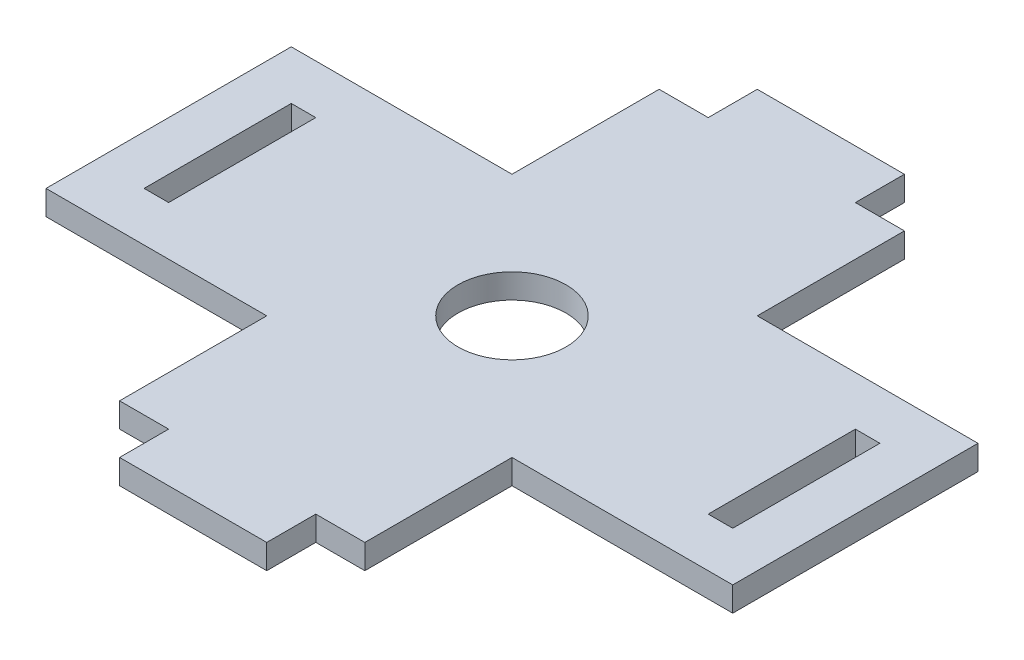
ISO-10303-21;
HEADER;
FILE_DESCRIPTION(('STEP AP214'),'2;1');
FILE_NAME('part.step','',(''),(''),'','','');
FILE_SCHEMA(('AUTOMOTIVE_DESIGN { 1 0 10303 214 1 1 1 1 }'));
ENDSEC;
DATA;
#1=APPLICATION_CONTEXT('core data for automotive mechanical design processes');
#2=APPLICATION_PROTOCOL_DEFINITION('international standard','automotive_design',2000,#1);
#3=PRODUCT_CONTEXT('',#1,'mechanical');
#4=PRODUCT('Part','Part','',(#3));
#5=PRODUCT_RELATED_PRODUCT_CATEGORY('part','',(#4));
#6=PRODUCT_DEFINITION_FORMATION('','',#4);
#7=PRODUCT_DEFINITION_CONTEXT('part definition',#1,'design');
#8=PRODUCT_DEFINITION('design','',#6,#7);
#9=PRODUCT_DEFINITION_SHAPE('','',#8);
#10=(LENGTH_UNIT() NAMED_UNIT(*) SI_UNIT(.MILLI.,.METRE.));
#11=(NAMED_UNIT(*) PLANE_ANGLE_UNIT() SI_UNIT($,.RADIAN.));
#12=(NAMED_UNIT(*) SI_UNIT($,.STERADIAN.) SOLID_ANGLE_UNIT());
#13=UNCERTAINTY_MEASURE_WITH_UNIT(LENGTH_MEASURE(1.E-05),#10,'distance_accuracy_value','');
#14=(GEOMETRIC_REPRESENTATION_CONTEXT(3) GLOBAL_UNCERTAINTY_ASSIGNED_CONTEXT((#13)) GLOBAL_UNIT_ASSIGNED_CONTEXT((#10,
#11,#12)) REPRESENTATION_CONTEXT('',''));
#15=CARTESIAN_POINT('',(0.,0.,0.));
#16=DIRECTION('',(0.,0.,1.));
#17=DIRECTION('',(1.,0.,0.));
#18=AXIS2_PLACEMENT_3D('',#15,#16,#17);
#19=CARTESIAN_POINT('',(-15.,5.,-55.));
#20=DIRECTION('',(0.,0.,1.));
#21=DIRECTION('',(1.,0.,0.));
#22=AXIS2_PLACEMENT_3D('',#19,#20,#21);
#23=PLANE('',#22);
#24=DIRECTION('',(-1.,0.,0.));
#25=VECTOR('',#24,1.);
#26=CARTESIAN_POINT('',(-15.,0.,-55.));
#27=LINE('',#26,#25);
#28=CARTESIAN_POINT('',(-15.,0.,-55.));
#29=VERTEX_POINT('',#28);
#30=CARTESIAN_POINT('',(-25.,0.,-55.));
#31=VERTEX_POINT('',#30);
#32=EDGE_CURVE('E334',#29,#31,#27,.T.);
#33=ORIENTED_EDGE('',*,*,#32,.T.);
#34=DIRECTION('',(0.,-1.,0.));
#35=VECTOR('',#34,1.);
#36=CARTESIAN_POINT('',(-25.,100.,-55.));
#37=LINE('',#36,#35);
#38=CARTESIAN_POINT('',(-25.,5.,-55.));
#39=VERTEX_POINT('',#38);
#40=EDGE_CURVE('E239',#39,#31,#37,.T.);
#41=ORIENTED_EDGE('',*,*,#40,.F.);
#42=DIRECTION('',(-1.,0.,0.));
#43=VECTOR('',#42,1.);
#44=CARTESIAN_POINT('',(-15.,5.,-55.));
#45=LINE('',#44,#43);
#46=CARTESIAN_POINT('',(-15.,5.,-55.));
#47=VERTEX_POINT('',#46);
#48=EDGE_CURVE('E359',#47,#39,#45,.T.);
#49=ORIENTED_EDGE('',*,*,#48,.F.);
#50=DIRECTION('',(0.,-1.,0.));
#51=VECTOR('',#50,1.);
#52=CARTESIAN_POINT('',(-15.,5.,-55.));
#53=LINE('',#52,#51);
#54=EDGE_CURVE('E388',#47,#29,#53,.T.);
#55=ORIENTED_EDGE('',*,*,#54,.T.);
#56=EDGE_LOOP('',(#33,#41,#49,#55));
#57=FACE_BOUND('',#56,.T.);
#58=ADVANCED_FACE('F44',(#57),#23,.F.);
#59=CARTESIAN_POINT('',(-70.,5.,55.));
#60=DIRECTION('',(1.,0.,0.));
#61=DIRECTION('',(0.,0.,-1.));
#62=AXIS2_PLACEMENT_3D('',#59,#60,#61);
#63=PLANE('',#62);
#64=DIRECTION('',(0.,0.,1.));
#65=VECTOR('',#64,1.);
#66=CARTESIAN_POINT('',(-70.,5.,55.));
#67=LINE('',#66,#65);
#68=CARTESIAN_POINT('',(-70.,5.,-25.));
#69=VERTEX_POINT('',#68);
#70=CARTESIAN_POINT('',(-70.,5.,25.));
#71=VERTEX_POINT('',#70);
#72=EDGE_CURVE('E362',#69,#71,#67,.T.);
#73=ORIENTED_EDGE('',*,*,#72,.F.);
#74=DIRECTION('',(0.,-1.,0.));
#75=VECTOR('',#74,1.);
#76=CARTESIAN_POINT('',(-70.,100.,-25.));
#77=LINE('',#76,#75);
#78=CARTESIAN_POINT('',(-70.,0.,-25.));
#79=VERTEX_POINT('',#78);
#80=EDGE_CURVE('E238',#69,#79,#77,.T.);
#81=ORIENTED_EDGE('',*,*,#80,.T.);
#82=DIRECTION('',(0.,0.,1.));
#83=VECTOR('',#82,1.);
#84=CARTESIAN_POINT('',(-70.,0.,55.));
#85=LINE('',#84,#83);
#86=CARTESIAN_POINT('',(-70.,0.,25.));
#87=VERTEX_POINT('',#86);
#88=EDGE_CURVE('E255',#79,#87,#85,.T.);
#89=ORIENTED_EDGE('',*,*,#88,.T.);
#90=DIRECTION('',(0.,-1.,0.));
#91=VECTOR('',#90,1.);
#92=CARTESIAN_POINT('',(-70.,100.,25.));
#93=LINE('',#92,#91);
#94=EDGE_CURVE('E58',#71,#87,#93,.T.);
#95=ORIENTED_EDGE('',*,*,#94,.F.);
#96=EDGE_LOOP('',(#73,#81,#89,#95));
#97=FACE_BOUND('',#96,.T.);
#98=ADVANCED_FACE('F525',(#97),#63,.F.);
#99=CARTESIAN_POINT('',(-15.,5.,55.));
#100=DIRECTION('',(0.,0.,-1.));
#101=DIRECTION('',(-1.,0.,0.));
#102=AXIS2_PLACEMENT_3D('',#99,#100,#101);
#103=PLANE('',#102);
#104=DIRECTION('',(1.,0.,0.));
#105=VECTOR('',#104,1.);
#106=CARTESIAN_POINT('',(-15.,5.,55.));
#107=LINE('',#106,#105);
#108=CARTESIAN_POINT('',(-25.,5.,55.));
#109=VERTEX_POINT('',#108);
#110=CARTESIAN_POINT('',(-15.,5.,55.));
#111=VERTEX_POINT('',#110);
#112=EDGE_CURVE('E366',#109,#111,#107,.T.);
#113=ORIENTED_EDGE('',*,*,#112,.F.);
#114=DIRECTION('',(0.,-1.,0.));
#115=VECTOR('',#114,1.);
#116=CARTESIAN_POINT('',(-25.,100.,55.));
#117=LINE('',#116,#115);
#118=CARTESIAN_POINT('',(-25.,0.,55.));
#119=VERTEX_POINT('',#118);
#120=EDGE_CURVE('E285',#109,#119,#117,.T.);
#121=ORIENTED_EDGE('',*,*,#120,.T.);
#122=DIRECTION('',(1.,0.,0.));
#123=VECTOR('',#122,1.);
#124=CARTESIAN_POINT('',(-15.,0.,55.));
#125=LINE('',#124,#123);
#126=CARTESIAN_POINT('',(-15.,0.,55.));
#127=VERTEX_POINT('',#126);
#128=EDGE_CURVE('E391',#119,#127,#125,.T.);
#129=ORIENTED_EDGE('',*,*,#128,.T.);
#130=DIRECTION('',(0.,-1.,0.));
#131=VECTOR('',#130,1.);
#132=CARTESIAN_POINT('',(-15.,5.,55.));
#133=LINE('',#132,#131);
#134=EDGE_CURVE('E432',#111,#127,#133,.T.);
#135=ORIENTED_EDGE('',*,*,#134,.F.);
#136=EDGE_LOOP('',(#113,#121,#129,#135));
#137=FACE_BOUND('',#136,.T.);
#138=ADVANCED_FACE('F529',(#137),#103,.F.);
#139=CARTESIAN_POINT('',(-15.,5.,65.));
#140=DIRECTION('',(1.,0.,0.));
#141=DIRECTION('',(0.,0.,-1.));
#142=AXIS2_PLACEMENT_3D('',#139,#140,#141);
#143=PLANE('',#142);
#144=DIRECTION('',(0.,0.,1.));
#145=VECTOR('',#144,1.);
#146=CARTESIAN_POINT('',(-15.,0.,65.));
#147=LINE('',#146,#145);
#148=CARTESIAN_POINT('',(-15.,0.,65.));
#149=VERTEX_POINT('',#148);
#150=EDGE_CURVE('E393',#127,#149,#147,.T.);
#151=ORIENTED_EDGE('',*,*,#150,.T.);
#152=DIRECTION('',(0.,-1.,0.));
#153=VECTOR('',#152,1.);
#154=CARTESIAN_POINT('',(-15.,5.,65.));
#155=LINE('',#154,#153);
#156=CARTESIAN_POINT('',(-15.,5.,65.));
#157=VERTEX_POINT('',#156);
#158=EDGE_CURVE('E429',#157,#149,#155,.T.);
#159=ORIENTED_EDGE('',*,*,#158,.F.);
#160=DIRECTION('',(0.,0.,1.));
#161=VECTOR('',#160,1.);
#162=CARTESIAN_POINT('',(-15.,5.,65.));
#163=LINE('',#162,#161);
#164=EDGE_CURVE('E368',#111,#157,#163,.T.);
#165=ORIENTED_EDGE('',*,*,#164,.F.);
#166=ORIENTED_EDGE('',*,*,#134,.T.);
#167=EDGE_LOOP('',(#151,#159,#165,#166));
#168=FACE_BOUND('',#167,.T.);
#169=ADVANCED_FACE('F534',(#168),#143,.F.);
#170=CARTESIAN_POINT('',(-15.,5.,65.));
#171=DIRECTION('',(0.,0.,-1.));
#172=DIRECTION('',(-1.,0.,0.));
#173=AXIS2_PLACEMENT_3D('',#170,#171,#172);
#174=PLANE('',#173);
#175=DIRECTION('',(1.,0.,0.));
#176=VECTOR('',#175,1.);
#177=CARTESIAN_POINT('',(-15.,0.,65.));
#178=LINE('',#177,#176);
#179=CARTESIAN_POINT('',(15.,0.,65.));
#180=VERTEX_POINT('',#179);
#181=EDGE_CURVE('E395',#149,#180,#178,.T.);
#182=ORIENTED_EDGE('',*,*,#181,.T.);
#183=DIRECTION('',(0.,-1.,0.));
#184=VECTOR('',#183,1.);
#185=CARTESIAN_POINT('',(15.,5.,65.));
#186=LINE('',#185,#184);
#187=CARTESIAN_POINT('',(15.,5.,65.));
#188=VERTEX_POINT('',#187);
#189=EDGE_CURVE('E426',#188,#180,#186,.T.);
#190=ORIENTED_EDGE('',*,*,#189,.F.);
#191=DIRECTION('',(1.,0.,0.));
#192=VECTOR('',#191,1.);
#193=CARTESIAN_POINT('',(-15.,5.,65.));
#194=LINE('',#193,#192);
#195=EDGE_CURVE('E370',#157,#188,#194,.T.);
#196=ORIENTED_EDGE('',*,*,#195,.F.);
#197=ORIENTED_EDGE('',*,*,#158,.T.);
#198=EDGE_LOOP('',(#182,#190,#196,#197));
#199=FACE_BOUND('',#198,.T.);
#200=ADVANCED_FACE('F541',(#199),#174,.F.);
#201=CARTESIAN_POINT('',(15.,5.,65.));
#202=DIRECTION('',(-1.,0.,0.));
#203=DIRECTION('',(0.,0.,1.));
#204=AXIS2_PLACEMENT_3D('',#201,#202,#203);
#205=PLANE('',#204);
#206=DIRECTION('',(0.,0.,-1.));
#207=VECTOR('',#206,1.);
#208=CARTESIAN_POINT('',(15.,0.,65.));
#209=LINE('',#208,#207);
#210=CARTESIAN_POINT('',(15.,0.,55.));
#211=VERTEX_POINT('',#210);
#212=EDGE_CURVE('E397',#180,#211,#209,.T.);
#213=ORIENTED_EDGE('',*,*,#212,.T.);
#214=DIRECTION('',(0.,-1.,0.));
#215=VECTOR('',#214,1.);
#216=CARTESIAN_POINT('',(15.,5.,55.));
#217=LINE('',#216,#215);
#218=CARTESIAN_POINT('',(15.,5.,55.));
#219=VERTEX_POINT('',#218);
#220=EDGE_CURVE('E423',#219,#211,#217,.T.);
#221=ORIENTED_EDGE('',*,*,#220,.F.);
#222=DIRECTION('',(0.,0.,-1.));
#223=VECTOR('',#222,1.);
#224=CARTESIAN_POINT('',(15.,5.,65.));
#225=LINE('',#224,#223);
#226=EDGE_CURVE('E372',#188,#219,#225,.T.);
#227=ORIENTED_EDGE('',*,*,#226,.F.);
#228=ORIENTED_EDGE('',*,*,#189,.T.);
#229=EDGE_LOOP('',(#213,#221,#227,#228));
#230=FACE_BOUND('',#229,.T.);
#231=ADVANCED_FACE('F545',(#230),#205,.F.);
#232=CARTESIAN_POINT('',(70.,5.,55.));
#233=DIRECTION('',(0.,0.,-1.));
#234=DIRECTION('',(-1.,0.,0.));
#235=AXIS2_PLACEMENT_3D('',#232,#233,#234);
#236=PLANE('',#235);
#237=DIRECTION('',(1.,0.,0.));
#238=VECTOR('',#237,1.);
#239=CARTESIAN_POINT('',(70.,0.,55.));
#240=LINE('',#239,#238);
#241=CARTESIAN_POINT('',(25.,0.,55.));
#242=VERTEX_POINT('',#241);
#243=EDGE_CURVE('E399',#211,#242,#240,.T.);
#244=ORIENTED_EDGE('',*,*,#243,.T.);
#245=DIRECTION('',(0.,-1.,0.));
#246=VECTOR('',#245,1.);
#247=CARTESIAN_POINT('',(25.,100.,55.));
#248=LINE('',#247,#246);
#249=CARTESIAN_POINT('',(25.,5.,55.));
#250=VERTEX_POINT('',#249);
#251=EDGE_CURVE('E66',#250,#242,#248,.T.);
#252=ORIENTED_EDGE('',*,*,#251,.F.);
#253=DIRECTION('',(1.,0.,0.));
#254=VECTOR('',#253,1.);
#255=CARTESIAN_POINT('',(70.,5.,55.));
#256=LINE('',#255,#254);
#257=EDGE_CURVE('E374',#219,#250,#256,.T.);
#258=ORIENTED_EDGE('',*,*,#257,.F.);
#259=ORIENTED_EDGE('',*,*,#220,.T.);
#260=EDGE_LOOP('',(#244,#252,#258,#259));
#261=FACE_BOUND('',#260,.T.);
#262=ADVANCED_FACE('F485',(#261),#236,.F.);
#263=CARTESIAN_POINT('',(70.,5.,55.));
#264=DIRECTION('',(-1.,0.,0.));
#265=DIRECTION('',(0.,0.,1.));
#266=AXIS2_PLACEMENT_3D('',#263,#264,#265);
#267=PLANE('',#266);
#268=DIRECTION('',(0.,0.,-1.));
#269=VECTOR('',#268,1.);
#270=CARTESIAN_POINT('',(70.,5.,55.));
#271=LINE('',#270,#269);
#272=CARTESIAN_POINT('',(70.,5.,25.));
#273=VERTEX_POINT('',#272);
#274=CARTESIAN_POINT('',(70.,5.,-25.));
#275=VERTEX_POINT('',#274);
#276=EDGE_CURVE('E377',#273,#275,#271,.T.);
#277=ORIENTED_EDGE('',*,*,#276,.F.);
#278=DIRECTION('',(0.,-1.,0.));
#279=VECTOR('',#278,1.);
#280=CARTESIAN_POINT('',(70.,100.,25.));
#281=LINE('',#280,#279);
#282=CARTESIAN_POINT('',(70.,0.,25.));
#283=VERTEX_POINT('',#282);
#284=EDGE_CURVE('E265',#273,#283,#281,.T.);
#285=ORIENTED_EDGE('',*,*,#284,.T.);
#286=DIRECTION('',(0.,0.,-1.));
#287=VECTOR('',#286,1.);
#288=CARTESIAN_POINT('',(70.,0.,55.));
#289=LINE('',#288,#287);
#290=CARTESIAN_POINT('',(70.,0.,-25.));
#291=VERTEX_POINT('',#290);
#292=EDGE_CURVE('E402',#283,#291,#289,.T.);
#293=ORIENTED_EDGE('',*,*,#292,.T.);
#294=DIRECTION('',(0.,-1.,0.));
#295=VECTOR('',#294,1.);
#296=CARTESIAN_POINT('',(70.,100.,-25.));
#297=LINE('',#296,#295);
#298=EDGE_CURVE('E267',#275,#291,#297,.T.);
#299=ORIENTED_EDGE('',*,*,#298,.F.);
#300=EDGE_LOOP('',(#277,#285,#293,#299));
#301=FACE_BOUND('',#300,.T.);
#302=ADVANCED_FACE('F495',(#301),#267,.F.);
#303=CARTESIAN_POINT('',(70.,5.,-55.));
#304=DIRECTION('',(0.,0.,1.));
#305=DIRECTION('',(1.,0.,0.));
#306=AXIS2_PLACEMENT_3D('',#303,#304,#305);
#307=PLANE('',#306);
#308=DIRECTION('',(-1.,0.,0.));
#309=VECTOR('',#308,1.);
#310=CARTESIAN_POINT('',(70.,5.,-55.));
#311=LINE('',#310,#309);
#312=CARTESIAN_POINT('',(25.,5.,-55.));
#313=VERTEX_POINT('',#312);
#314=CARTESIAN_POINT('',(15.,5.,-55.));
#315=VERTEX_POINT('',#314);
#316=EDGE_CURVE('E380',#313,#315,#311,.T.);
#317=ORIENTED_EDGE('',*,*,#316,.F.);
#318=DIRECTION('',(0.,-1.,0.));
#319=VECTOR('',#318,1.);
#320=CARTESIAN_POINT('',(25.,100.,-55.));
#321=LINE('',#320,#319);
#322=CARTESIAN_POINT('',(25.,0.,-55.));
#323=VERTEX_POINT('',#322);
#324=EDGE_CURVE('E248',#313,#323,#321,.T.);
#325=ORIENTED_EDGE('',*,*,#324,.T.);
#326=DIRECTION('',(-1.,0.,0.));
#327=VECTOR('',#326,1.);
#328=CARTESIAN_POINT('',(70.,0.,-55.));
#329=LINE('',#328,#327);
#330=CARTESIAN_POINT('',(15.,0.,-55.));
#331=VERTEX_POINT('',#330);
#332=EDGE_CURVE('E405',#323,#331,#329,.T.);
#333=ORIENTED_EDGE('',*,*,#332,.T.);
#334=DIRECTION('',(0.,-1.,0.));
#335=VECTOR('',#334,1.);
#336=CARTESIAN_POINT('',(15.,5.,-55.));
#337=LINE('',#336,#335);
#338=EDGE_CURVE('E420',#315,#331,#337,.T.);
#339=ORIENTED_EDGE('',*,*,#338,.F.);
#340=EDGE_LOOP('',(#317,#325,#333,#339));
#341=FACE_BOUND('',#340,.T.);
#342=ADVANCED_FACE('F506',(#341),#307,.F.);
#343=CARTESIAN_POINT('',(15.,5.,-65.));
#344=DIRECTION('',(-1.,0.,0.));
#345=DIRECTION('',(0.,0.,1.));
#346=AXIS2_PLACEMENT_3D('',#343,#344,#345);
#347=PLANE('',#346);
#348=DIRECTION('',(0.,0.,-1.));
#349=VECTOR('',#348,1.);
#350=CARTESIAN_POINT('',(15.,0.,-65.));
#351=LINE('',#350,#349);
#352=CARTESIAN_POINT('',(15.,0.,-65.));
#353=VERTEX_POINT('',#352);
#354=EDGE_CURVE('E407',#331,#353,#351,.T.);
#355=ORIENTED_EDGE('',*,*,#354,.T.);
#356=DIRECTION('',(0.,-1.,0.));
#357=VECTOR('',#356,1.);
#358=CARTESIAN_POINT('',(15.,5.,-65.));
#359=LINE('',#358,#357);
#360=CARTESIAN_POINT('',(15.,5.,-65.));
#361=VERTEX_POINT('',#360);
#362=EDGE_CURVE('E417',#361,#353,#359,.T.);
#363=ORIENTED_EDGE('',*,*,#362,.F.);
#364=DIRECTION('',(0.,0.,-1.));
#365=VECTOR('',#364,1.);
#366=CARTESIAN_POINT('',(15.,5.,-65.));
#367=LINE('',#366,#365);
#368=EDGE_CURVE('E382',#315,#361,#367,.T.);
#369=ORIENTED_EDGE('',*,*,#368,.F.);
#370=ORIENTED_EDGE('',*,*,#338,.T.);
#371=EDGE_LOOP('',(#355,#363,#369,#370));
#372=FACE_BOUND('',#371,.T.);
#373=ADVANCED_FACE('F513',(#372),#347,.F.);
#374=CARTESIAN_POINT('',(-15.,5.,-65.));
#375=DIRECTION('',(0.,0.,1.));
#376=DIRECTION('',(1.,0.,0.));
#377=AXIS2_PLACEMENT_3D('',#374,#375,#376);
#378=PLANE('',#377);
#379=DIRECTION('',(-1.,0.,0.));
#380=VECTOR('',#379,1.);
#381=CARTESIAN_POINT('',(-15.,0.,-65.));
#382=LINE('',#381,#380);
#383=CARTESIAN_POINT('',(-15.,0.,-65.));
#384=VERTEX_POINT('',#383);
#385=EDGE_CURVE('E409',#353,#384,#382,.T.);
#386=ORIENTED_EDGE('',*,*,#385,.T.);
#387=DIRECTION('',(0.,-1.,0.));
#388=VECTOR('',#387,1.);
#389=CARTESIAN_POINT('',(-15.,5.,-65.));
#390=LINE('',#389,#388);
#391=CARTESIAN_POINT('',(-15.,5.,-65.));
#392=VERTEX_POINT('',#391);
#393=EDGE_CURVE('E414',#392,#384,#390,.T.);
#394=ORIENTED_EDGE('',*,*,#393,.F.);
#395=DIRECTION('',(-1.,0.,0.));
#396=VECTOR('',#395,1.);
#397=CARTESIAN_POINT('',(-15.,5.,-65.));
#398=LINE('',#397,#396);
#399=EDGE_CURVE('E384',#361,#392,#398,.T.);
#400=ORIENTED_EDGE('',*,*,#399,.F.);
#401=ORIENTED_EDGE('',*,*,#362,.T.);
#402=EDGE_LOOP('',(#386,#394,#400,#401));
#403=FACE_BOUND('',#402,.T.);
#404=ADVANCED_FACE('F517',(#403),#378,.F.);
#405=CARTESIAN_POINT('',(-15.,5.,-65.));
#406=DIRECTION('',(1.,0.,0.));
#407=DIRECTION('',(0.,0.,-1.));
#408=AXIS2_PLACEMENT_3D('',#405,#406,#407);
#409=PLANE('',#408);
#410=DIRECTION('',(0.,0.,1.));
#411=VECTOR('',#410,1.);
#412=CARTESIAN_POINT('',(-15.,0.,-65.));
#413=LINE('',#412,#411);
#414=EDGE_CURVE('E363',#384,#29,#413,.T.);
#415=ORIENTED_EDGE('',*,*,#414,.T.);
#416=ORIENTED_EDGE('',*,*,#54,.F.);
#417=DIRECTION('',(0.,0.,1.));
#418=VECTOR('',#417,1.);
#419=CARTESIAN_POINT('',(-15.,5.,-65.));
#420=LINE('',#419,#418);
#421=EDGE_CURVE('E386',#392,#47,#420,.T.);
#422=ORIENTED_EDGE('',*,*,#421,.F.);
#423=ORIENTED_EDGE('',*,*,#393,.T.);
#424=EDGE_LOOP('',(#415,#416,#422,#423));
#425=FACE_BOUND('',#424,.T.);
#426=ADVANCED_FACE('F473',(#425),#409,.F.);
#427=CARTESIAN_POINT('',(0.,5.,0.));
#428=DIRECTION('',(0.,-1.,0.));
#429=DIRECTION('',(0.,0.,-1.));
#430=AXIS2_PLACEMENT_3D('',#427,#428,#429);
#431=PLANE('',#430);
#432=CARTESIAN_POINT('',(0.,5.,0.));
#433=DIRECTION('',(0.,-1.,0.));
#434=DIRECTION('',(0.,0.,-1.));
#435=AXIS2_PLACEMENT_3D('',#432,#433,#434);
#436=CIRCLE('',#435,11.);
#437=CARTESIAN_POINT('',(0.,5.,-11.));
#438=VERTEX_POINT('',#437);
#439=EDGE_CURVE('E315',#438,#438,#436,.T.);
#440=ORIENTED_EDGE('',*,*,#439,.T.);
#441=EDGE_LOOP('',(#440));
#442=FACE_BOUND('',#441,.T.);
#443=DIRECTION('',(1.,0.,0.));
#444=VECTOR('',#443,1.);
#445=CARTESIAN_POINT('',(-60.,5.,15.));
#446=LINE('',#445,#444);
#447=CARTESIAN_POINT('',(-60.,5.,15.));
#448=VERTEX_POINT('',#447);
#449=CARTESIAN_POINT('',(-55.,5.,15.));
#450=VERTEX_POINT('',#449);
#451=EDGE_CURVE('E321',#448,#450,#446,.T.);
#452=ORIENTED_EDGE('',*,*,#451,.F.);
#453=DIRECTION('',(0.,0.,1.));
#454=VECTOR('',#453,1.);
#455=CARTESIAN_POINT('',(-60.,5.,-15.));
#456=LINE('',#455,#454);
#457=CARTESIAN_POINT('',(-60.,5.,-15.));
#458=VERTEX_POINT('',#457);
#459=EDGE_CURVE('E319',#458,#448,#456,.T.);
#460=ORIENTED_EDGE('',*,*,#459,.F.);
#461=DIRECTION('',(-1.,0.,0.));
#462=VECTOR('',#461,1.);
#463=CARTESIAN_POINT('',(-60.,5.,-15.));
#464=LINE('',#463,#462);
#465=CARTESIAN_POINT('',(-55.,5.,-15.));
#466=VERTEX_POINT('',#465);
#467=EDGE_CURVE('E328',#466,#458,#464,.T.);
#468=ORIENTED_EDGE('',*,*,#467,.F.);
#469=DIRECTION('',(0.,0.,-1.));
#470=VECTOR('',#469,1.);
#471=CARTESIAN_POINT('',(-55.,5.,-15.));
#472=LINE('',#471,#470);
#473=EDGE_CURVE('E325',#450,#466,#472,.T.);
#474=ORIENTED_EDGE('',*,*,#473,.F.);
#475=EDGE_LOOP('',(#452,#460,#468,#474));
#476=FACE_BOUND('',#475,.T.);
#477=DIRECTION('',(-1.,0.,0.));
#478=VECTOR('',#477,1.);
#479=CARTESIAN_POINT('',(60.,5.,-15.));
#480=LINE('',#479,#478);
#481=CARTESIAN_POINT('',(60.,5.,-15.));
#482=VERTEX_POINT('',#481);
#483=CARTESIAN_POINT('',(55.,5.,-15.));
#484=VERTEX_POINT('',#483);
#485=EDGE_CURVE('E342',#482,#484,#480,.T.);
#486=ORIENTED_EDGE('',*,*,#485,.F.);
#487=DIRECTION('',(0.,0.,-1.));
#488=VECTOR('',#487,1.);
#489=CARTESIAN_POINT('',(60.,5.,-15.));
#490=LINE('',#489,#488);
#491=CARTESIAN_POINT('',(60.,5.,15.));
#492=VERTEX_POINT('',#491);
#493=EDGE_CURVE('E318',#492,#482,#490,.T.);
#494=ORIENTED_EDGE('',*,*,#493,.F.);
#495=DIRECTION('',(1.,0.,0.));
#496=VECTOR('',#495,1.);
#497=CARTESIAN_POINT('',(60.,5.,15.));
#498=LINE('',#497,#496);
#499=CARTESIAN_POINT('',(55.,5.,15.));
#500=VERTEX_POINT('',#499);
#501=EDGE_CURVE('E348',#500,#492,#498,.T.);
#502=ORIENTED_EDGE('',*,*,#501,.F.);
#503=DIRECTION('',(0.,0.,1.));
#504=VECTOR('',#503,1.);
#505=CARTESIAN_POINT('',(55.,5.,-15.));
#506=LINE('',#505,#504);
#507=EDGE_CURVE('E345',#484,#500,#506,.T.);
#508=ORIENTED_EDGE('',*,*,#507,.F.);
#509=EDGE_LOOP('',(#486,#494,#502,#508));
#510=FACE_BOUND('',#509,.T.);
#511=DIRECTION('',(0.,0.,-1.));
#512=VECTOR('',#511,1.);
#513=CARTESIAN_POINT('',(25.,5.,0.));
#514=LINE('',#513,#512);
#515=CARTESIAN_POINT('',(25.,5.,25.));
#516=VERTEX_POINT('',#515);
#517=EDGE_CURVE('E306',#250,#516,#514,.T.);
#518=ORIENTED_EDGE('',*,*,#517,.T.);
#519=DIRECTION('',(1.,0.,0.));
#520=VECTOR('',#519,1.);
#521=CARTESIAN_POINT('',(0.,5.,25.));
#522=LINE('',#521,#520);
#523=EDGE_CURVE('E309',#516,#273,#522,.T.);
#524=ORIENTED_EDGE('',*,*,#523,.T.);
#525=ORIENTED_EDGE('',*,*,#276,.T.);
#526=DIRECTION('',(-1.,0.,0.));
#527=VECTOR('',#526,1.);
#528=CARTESIAN_POINT('',(0.,5.,-25.));
#529=LINE('',#528,#527);
#530=CARTESIAN_POINT('',(25.,5.,-25.));
#531=VERTEX_POINT('',#530);
#532=EDGE_CURVE('E300',#275,#531,#529,.T.);
#533=ORIENTED_EDGE('',*,*,#532,.T.);
#534=DIRECTION('',(0.,0.,-1.));
#535=VECTOR('',#534,1.);
#536=CARTESIAN_POINT('',(25.,5.,0.));
#537=LINE('',#536,#535);
#538=EDGE_CURVE('E303',#531,#313,#537,.T.);
#539=ORIENTED_EDGE('',*,*,#538,.T.);
#540=ORIENTED_EDGE('',*,*,#316,.T.);
#541=ORIENTED_EDGE('',*,*,#368,.T.);
#542=ORIENTED_EDGE('',*,*,#399,.T.);
#543=ORIENTED_EDGE('',*,*,#421,.T.);
#544=ORIENTED_EDGE('',*,*,#48,.T.);
#545=DIRECTION('',(0.,0.,1.));
#546=VECTOR('',#545,1.);
#547=CARTESIAN_POINT('',(-25.,5.,0.));
#548=LINE('',#547,#546);
#549=CARTESIAN_POINT('',(-25.,5.,-25.));
#550=VERTEX_POINT('',#549);
#551=EDGE_CURVE('E297',#39,#550,#548,.T.);
#552=ORIENTED_EDGE('',*,*,#551,.T.);
#553=DIRECTION('',(-1.,0.,0.));
#554=VECTOR('',#553,1.);
#555=CARTESIAN_POINT('',(0.,5.,-25.));
#556=LINE('',#555,#554);
#557=EDGE_CURVE('E235',#550,#69,#556,.T.);
#558=ORIENTED_EDGE('',*,*,#557,.T.);
#559=ORIENTED_EDGE('',*,*,#72,.T.);
#560=DIRECTION('',(1.,0.,0.));
#561=VECTOR('',#560,1.);
#562=CARTESIAN_POINT('',(0.,5.,25.));
#563=LINE('',#562,#561);
#564=CARTESIAN_POINT('',(-25.,5.,25.));
#565=VERTEX_POINT('',#564);
#566=EDGE_CURVE('E288',#71,#565,#563,.T.);
#567=ORIENTED_EDGE('',*,*,#566,.T.);
#568=DIRECTION('',(0.,0.,1.));
#569=VECTOR('',#568,1.);
#570=CARTESIAN_POINT('',(-25.,5.,0.));
#571=LINE('',#570,#569);
#572=EDGE_CURVE('E294',#565,#109,#571,.T.);
#573=ORIENTED_EDGE('',*,*,#572,.T.);
#574=ORIENTED_EDGE('',*,*,#112,.T.);
#575=ORIENTED_EDGE('',*,*,#164,.T.);
#576=ORIENTED_EDGE('',*,*,#195,.T.);
#577=ORIENTED_EDGE('',*,*,#226,.T.);
#578=ORIENTED_EDGE('',*,*,#257,.T.);
#579=EDGE_LOOP('',(#518,#524,#525,#533,#539,#540,#541,#542,#543,#544,#552,#558,#559,#567,#573,
#574,#575,#576,#577,#578));
#580=FACE_BOUND('',#579,.T.);
#581=ADVANCED_FACE('F470',(#442,#476,#510,#580),#431,.F.);
#582=CARTESIAN_POINT('',(0.,0.,0.));
#583=DIRECTION('',(0.,-1.,0.));
#584=DIRECTION('',(0.,0.,-1.));
#585=AXIS2_PLACEMENT_3D('',#582,#583,#584);
#586=PLANE('',#585);
#587=DIRECTION('',(1.,0.,0.));
#588=VECTOR('',#587,1.);
#589=CARTESIAN_POINT('',(70.,0.,25.));
#590=LINE('',#589,#588);
#591=CARTESIAN_POINT('',(25.,0.,25.));
#592=VERTEX_POINT('',#591);
#593=EDGE_CURVE('E275',#592,#283,#590,.T.);
#594=ORIENTED_EDGE('',*,*,#593,.F.);
#595=DIRECTION('',(0.,0.,-1.));
#596=VECTOR('',#595,1.);
#597=CARTESIAN_POINT('',(25.,0.,55.));
#598=LINE('',#597,#596);
#599=EDGE_CURVE('E273',#242,#592,#598,.T.);
#600=ORIENTED_EDGE('',*,*,#599,.F.);
#601=ORIENTED_EDGE('',*,*,#243,.F.);
#602=ORIENTED_EDGE('',*,*,#212,.F.);
#603=ORIENTED_EDGE('',*,*,#181,.F.);
#604=ORIENTED_EDGE('',*,*,#150,.F.);
#605=ORIENTED_EDGE('',*,*,#128,.F.);
#606=DIRECTION('',(0.,0.,1.));
#607=VECTOR('',#606,1.);
#608=CARTESIAN_POINT('',(-25.,0.,55.));
#609=LINE('',#608,#607);
#610=CARTESIAN_POINT('',(-25.,0.,25.));
#611=VERTEX_POINT('',#610);
#612=EDGE_CURVE('E283',#611,#119,#609,.T.);
#613=ORIENTED_EDGE('',*,*,#612,.F.);
#614=DIRECTION('',(1.,0.,0.));
#615=VECTOR('',#614,1.);
#616=CARTESIAN_POINT('',(-70.,0.,25.));
#617=LINE('',#616,#615);
#618=EDGE_CURVE('E259',#87,#611,#617,.T.);
#619=ORIENTED_EDGE('',*,*,#618,.F.);
#620=ORIENTED_EDGE('',*,*,#88,.F.);
#621=DIRECTION('',(-1.,0.,0.));
#622=VECTOR('',#621,1.);
#623=CARTESIAN_POINT('',(-70.,0.,-25.));
#624=LINE('',#623,#622);
#625=CARTESIAN_POINT('',(-25.,0.,-25.));
#626=VERTEX_POINT('',#625);
#627=EDGE_CURVE('E232',#626,#79,#624,.T.);
#628=ORIENTED_EDGE('',*,*,#627,.F.);
#629=DIRECTION('',(0.,0.,1.));
#630=VECTOR('',#629,1.);
#631=CARTESIAN_POINT('',(-25.,0.,-55.));
#632=LINE('',#631,#630);
#633=EDGE_CURVE('E242',#31,#626,#632,.T.);
#634=ORIENTED_EDGE('',*,*,#633,.F.);
#635=ORIENTED_EDGE('',*,*,#32,.F.);
#636=ORIENTED_EDGE('',*,*,#414,.F.);
#637=ORIENTED_EDGE('',*,*,#385,.F.);
#638=ORIENTED_EDGE('',*,*,#354,.F.);
#639=ORIENTED_EDGE('',*,*,#332,.F.);
#640=DIRECTION('',(0.,0.,-1.));
#641=VECTOR('',#640,1.);
#642=CARTESIAN_POINT('',(25.,0.,-55.));
#643=LINE('',#642,#641);
#644=CARTESIAN_POINT('',(25.,0.,-25.));
#645=VERTEX_POINT('',#644);
#646=EDGE_CURVE('E264',#645,#323,#643,.T.);
#647=ORIENTED_EDGE('',*,*,#646,.F.);
#648=DIRECTION('',(-1.,0.,0.));
#649=VECTOR('',#648,1.);
#650=CARTESIAN_POINT('',(70.,0.,-25.));
#651=LINE('',#650,#649);
#652=EDGE_CURVE('E261',#291,#645,#651,.T.);
#653=ORIENTED_EDGE('',*,*,#652,.F.);
#654=ORIENTED_EDGE('',*,*,#292,.F.);
#655=EDGE_LOOP('',(#594,#600,#601,#602,#603,#604,#605,#613,#619,#620,#628,#634,#635,#636,#637,
#638,#639,#647,#653,#654));
#656=FACE_BOUND('',#655,.T.);
#657=CARTESIAN_POINT('',(0.,0.,0.));
#658=DIRECTION('',(0.,-1.,0.));
#659=DIRECTION('',(0.,0.,-1.));
#660=AXIS2_PLACEMENT_3D('',#657,#658,#659);
#661=CIRCLE('',#660,11.);
#662=CARTESIAN_POINT('',(0.,0.,-11.));
#663=VERTEX_POINT('',#662);
#664=EDGE_CURVE('E312',#663,#663,#661,.T.);
#665=ORIENTED_EDGE('',*,*,#664,.F.);
#666=EDGE_LOOP('',(#665));
#667=FACE_BOUND('',#666,.T.);
#668=DIRECTION('',(0.,0.,-1.));
#669=VECTOR('',#668,1.);
#670=CARTESIAN_POINT('',(-60.,0.,0.));
#671=LINE('',#670,#669);
#672=CARTESIAN_POINT('',(-60.,0.,15.));
#673=VERTEX_POINT('',#672);
#674=CARTESIAN_POINT('',(-60.,0.,-15.));
#675=VERTEX_POINT('',#674);
#676=EDGE_CURVE('E13',#673,#675,#671,.T.);
#677=ORIENTED_EDGE('',*,*,#676,.F.);
#678=DIRECTION('',(-1.,0.,0.));
#679=VECTOR('',#678,1.);
#680=CARTESIAN_POINT('',(0.,0.,15.));
#681=LINE('',#680,#679);
#682=CARTESIAN_POINT('',(-55.,0.,15.));
#683=VERTEX_POINT('',#682);
#684=EDGE_CURVE('E444',#683,#673,#681,.T.);
#685=ORIENTED_EDGE('',*,*,#684,.F.);
#686=DIRECTION('',(0.,0.,1.));
#687=VECTOR('',#686,1.);
#688=CARTESIAN_POINT('',(-55.,0.,0.));
#689=LINE('',#688,#687);
#690=CARTESIAN_POINT('',(-55.,0.,-15.));
#691=VERTEX_POINT('',#690);
#692=EDGE_CURVE('E446',#691,#683,#689,.T.);
#693=ORIENTED_EDGE('',*,*,#692,.F.);
#694=DIRECTION('',(1.,0.,0.));
#695=VECTOR('',#694,1.);
#696=CARTESIAN_POINT('',(0.,0.,-15.));
#697=LINE('',#696,#695);
#698=EDGE_CURVE('E51',#675,#691,#697,.T.);
#699=ORIENTED_EDGE('',*,*,#698,.F.);
#700=EDGE_LOOP('',(#677,#685,#693,#699));
#701=FACE_BOUND('',#700,.T.);
#702=DIRECTION('',(0.,0.,1.));
#703=VECTOR('',#702,1.);
#704=CARTESIAN_POINT('',(60.,0.,0.));
#705=LINE('',#704,#703);
#706=CARTESIAN_POINT('',(60.,0.,-15.));
#707=VERTEX_POINT('',#706);
#708=CARTESIAN_POINT('',(60.,0.,15.));
#709=VERTEX_POINT('',#708);
#710=EDGE_CURVE('E442',#707,#709,#705,.T.);
#711=ORIENTED_EDGE('',*,*,#710,.F.);
#712=DIRECTION('',(1.,0.,0.));
#713=VECTOR('',#712,1.);
#714=CARTESIAN_POINT('',(0.,0.,-15.));
#715=LINE('',#714,#713);
#716=CARTESIAN_POINT('',(55.,0.,-15.));
#717=VERTEX_POINT('',#716);
#718=EDGE_CURVE('E435',#717,#707,#715,.T.);
#719=ORIENTED_EDGE('',*,*,#718,.F.);
#720=DIRECTION('',(0.,0.,-1.));
#721=VECTOR('',#720,1.);
#722=CARTESIAN_POINT('',(55.,0.,0.));
#723=LINE('',#722,#721);
#724=CARTESIAN_POINT('',(55.,0.,15.));
#725=VERTEX_POINT('',#724);
#726=EDGE_CURVE('E437',#725,#717,#723,.T.);
#727=ORIENTED_EDGE('',*,*,#726,.F.);
#728=DIRECTION('',(-1.,0.,0.));
#729=VECTOR('',#728,1.);
#730=CARTESIAN_POINT('',(0.,0.,15.));
#731=LINE('',#730,#729);
#732=EDGE_CURVE('E440',#709,#725,#731,.T.);
#733=ORIENTED_EDGE('',*,*,#732,.F.);
#734=EDGE_LOOP('',(#711,#719,#727,#733));
#735=FACE_BOUND('',#734,.T.);
#736=ADVANCED_FACE('F252',(#656,#667,#701,#735),#586,.T.);
#737=CARTESIAN_POINT('',(60.,-95.,-15.));
#738=DIRECTION('',(1.,0.,0.));
#739=DIRECTION('',(0.,0.,-1.));
#740=AXIS2_PLACEMENT_3D('',#737,#738,#739);
#741=PLANE('',#740);
#742=ORIENTED_EDGE('',*,*,#710,.T.);
#743=DIRECTION('',(0.,1.,0.));
#744=VECTOR('',#743,1.);
#745=CARTESIAN_POINT('',(60.,-95.,15.));
#746=LINE('',#745,#744);
#747=EDGE_CURVE('E322',#709,#492,#746,.T.);
#748=ORIENTED_EDGE('',*,*,#747,.T.);
#749=ORIENTED_EDGE('',*,*,#493,.T.);
#750=DIRECTION('',(0.,1.,0.));
#751=VECTOR('',#750,1.);
#752=CARTESIAN_POINT('',(60.,-95.,-15.));
#753=LINE('',#752,#751);
#754=EDGE_CURVE('E351',#707,#482,#753,.T.);
#755=ORIENTED_EDGE('',*,*,#754,.F.);
#756=EDGE_LOOP('',(#742,#748,#749,#755));
#757=FACE_BOUND('',#756,.T.);
#758=ADVANCED_FACE('F563',(#757),#741,.F.);
#759=CARTESIAN_POINT('',(60.,-95.,15.));
#760=DIRECTION('',(0.,0.,1.));
#761=DIRECTION('',(1.,0.,0.));
#762=AXIS2_PLACEMENT_3D('',#759,#760,#761);
#763=PLANE('',#762);
#764=ORIENTED_EDGE('',*,*,#732,.T.);
#765=DIRECTION('',(0.,1.,0.));
#766=VECTOR('',#765,1.);
#767=CARTESIAN_POINT('',(55.,-95.,15.));
#768=LINE('',#767,#766);
#769=EDGE_CURVE('E353',#725,#500,#768,.T.);
#770=ORIENTED_EDGE('',*,*,#769,.T.);
#771=ORIENTED_EDGE('',*,*,#501,.T.);
#772=ORIENTED_EDGE('',*,*,#747,.F.);
#773=EDGE_LOOP('',(#764,#770,#771,#772));
#774=FACE_BOUND('',#773,.T.);
#775=ADVANCED_FACE('F567',(#774),#763,.F.);
#776=CARTESIAN_POINT('',(55.,-95.,-15.));
#777=DIRECTION('',(-1.,0.,0.));
#778=DIRECTION('',(0.,0.,1.));
#779=AXIS2_PLACEMENT_3D('',#776,#777,#778);
#780=PLANE('',#779);
#781=ORIENTED_EDGE('',*,*,#726,.T.);
#782=DIRECTION('',(0.,1.,0.));
#783=VECTOR('',#782,1.);
#784=CARTESIAN_POINT('',(55.,-95.,-15.));
#785=LINE('',#784,#783);
#786=EDGE_CURVE('E355',#717,#484,#785,.T.);
#787=ORIENTED_EDGE('',*,*,#786,.T.);
#788=ORIENTED_EDGE('',*,*,#507,.T.);
#789=ORIENTED_EDGE('',*,*,#769,.F.);
#790=EDGE_LOOP('',(#781,#787,#788,#789));
#791=FACE_BOUND('',#790,.T.);
#792=ADVANCED_FACE('F572',(#791),#780,.F.);
#793=CARTESIAN_POINT('',(60.,-95.,-15.));
#794=DIRECTION('',(0.,0.,-1.));
#795=DIRECTION('',(-1.,0.,0.));
#796=AXIS2_PLACEMENT_3D('',#793,#794,#795);
#797=PLANE('',#796);
#798=ORIENTED_EDGE('',*,*,#718,.T.);
#799=ORIENTED_EDGE('',*,*,#754,.T.);
#800=ORIENTED_EDGE('',*,*,#485,.T.);
#801=ORIENTED_EDGE('',*,*,#786,.F.);
#802=EDGE_LOOP('',(#798,#799,#800,#801));
#803=FACE_BOUND('',#802,.T.);
#804=ADVANCED_FACE('F569',(#803),#797,.F.);
#805=CARTESIAN_POINT('',(-60.,-95.,-15.));
#806=DIRECTION('',(-1.,0.,0.));
#807=DIRECTION('',(0.,0.,1.));
#808=AXIS2_PLACEMENT_3D('',#805,#806,#807);
#809=PLANE('',#808);
#810=ORIENTED_EDGE('',*,*,#676,.T.);
#811=DIRECTION('',(0.,1.,0.));
#812=VECTOR('',#811,1.);
#813=CARTESIAN_POINT('',(-60.,-95.,-15.));
#814=LINE('',#813,#812);
#815=EDGE_CURVE('E332',#675,#458,#814,.T.);
#816=ORIENTED_EDGE('',*,*,#815,.T.);
#817=ORIENTED_EDGE('',*,*,#459,.T.);
#818=DIRECTION('',(0.,1.,0.));
#819=VECTOR('',#818,1.);
#820=CARTESIAN_POINT('',(-60.,-95.,15.));
#821=LINE('',#820,#819);
#822=EDGE_CURVE('E331',#673,#448,#821,.T.);
#823=ORIENTED_EDGE('',*,*,#822,.F.);
#824=EDGE_LOOP('',(#810,#816,#817,#823));
#825=FACE_BOUND('',#824,.T.);
#826=ADVANCED_FACE('F467',(#825),#809,.F.);
#827=CARTESIAN_POINT('',(-60.,-95.,-15.));
#828=DIRECTION('',(0.,0.,-1.));
#829=DIRECTION('',(-1.,0.,0.));
#830=AXIS2_PLACEMENT_3D('',#827,#828,#829);
#831=PLANE('',#830);
#832=ORIENTED_EDGE('',*,*,#698,.T.);
#833=DIRECTION('',(0.,1.,0.));
#834=VECTOR('',#833,1.);
#835=CARTESIAN_POINT('',(-55.,-95.,-15.));
#836=LINE('',#835,#834);
#837=EDGE_CURVE('E335',#691,#466,#836,.T.);
#838=ORIENTED_EDGE('',*,*,#837,.T.);
#839=ORIENTED_EDGE('',*,*,#467,.T.);
#840=ORIENTED_EDGE('',*,*,#815,.F.);
#841=EDGE_LOOP('',(#832,#838,#839,#840));
#842=FACE_BOUND('',#841,.T.);
#843=ADVANCED_FACE('F452',(#842),#831,.F.);
#844=CARTESIAN_POINT('',(-55.,-95.,-15.));
#845=DIRECTION('',(1.,0.,0.));
#846=DIRECTION('',(0.,0.,-1.));
#847=AXIS2_PLACEMENT_3D('',#844,#845,#846);
#848=PLANE('',#847);
#849=ORIENTED_EDGE('',*,*,#692,.T.);
#850=DIRECTION('',(0.,1.,0.));
#851=VECTOR('',#850,1.);
#852=CARTESIAN_POINT('',(-55.,-95.,15.));
#853=LINE('',#852,#851);
#854=EDGE_CURVE('E337',#683,#450,#853,.T.);
#855=ORIENTED_EDGE('',*,*,#854,.T.);
#856=ORIENTED_EDGE('',*,*,#473,.T.);
#857=ORIENTED_EDGE('',*,*,#837,.F.);
#858=EDGE_LOOP('',(#849,#855,#856,#857));
#859=FACE_BOUND('',#858,.T.);
#860=ADVANCED_FACE('F457',(#859),#848,.F.);
#861=CARTESIAN_POINT('',(-60.,-95.,15.));
#862=DIRECTION('',(0.,0.,1.));
#863=DIRECTION('',(1.,0.,0.));
#864=AXIS2_PLACEMENT_3D('',#861,#862,#863);
#865=PLANE('',#864);
#866=ORIENTED_EDGE('',*,*,#684,.T.);
#867=ORIENTED_EDGE('',*,*,#822,.T.);
#868=ORIENTED_EDGE('',*,*,#451,.T.);
#869=ORIENTED_EDGE('',*,*,#854,.F.);
#870=EDGE_LOOP('',(#866,#867,#868,#869));
#871=FACE_BOUND('',#870,.T.);
#872=ADVANCED_FACE('F464',(#871),#865,.F.);
#873=CARTESIAN_POINT('',(0.,100.,0.));
#874=DIRECTION('',(0.,-1.,0.));
#875=DIRECTION('',(0.,0.,-1.));
#876=AXIS2_PLACEMENT_3D('',#873,#874,#875);
#877=CYLINDRICAL_SURFACE('',#876,11.);
#878=ORIENTED_EDGE('',*,*,#664,.T.);
#879=EDGE_LOOP('',(#878));
#880=FACE_BOUND('',#879,.T.);
#881=ORIENTED_EDGE('',*,*,#439,.F.);
#882=EDGE_LOOP('',(#881));
#883=FACE_BOUND('',#882,.T.);
#884=ADVANCED_FACE('F584',(#880,#883),#877,.F.);
#885=CARTESIAN_POINT('',(-25.,100.,55.));
#886=DIRECTION('',(1.,0.,0.));
#887=DIRECTION('',(0.,0.,-1.));
#888=AXIS2_PLACEMENT_3D('',#885,#886,#887);
#889=PLANE('',#888);
#890=DIRECTION('',(0.,-1.,0.));
#891=VECTOR('',#890,1.);
#892=CARTESIAN_POINT('',(-25.,100.,25.));
#893=LINE('',#892,#891);
#894=EDGE_CURVE('E289',#565,#611,#893,.T.);
#895=ORIENTED_EDGE('',*,*,#894,.T.);
#896=ORIENTED_EDGE('',*,*,#612,.T.);
#897=ORIENTED_EDGE('',*,*,#120,.F.);
#898=ORIENTED_EDGE('',*,*,#572,.F.);
#899=EDGE_LOOP('',(#895,#896,#897,#898));
#900=FACE_BOUND('',#899,.T.);
#901=ADVANCED_FACE('F591',(#900),#889,.F.);
#902=CARTESIAN_POINT('',(-70.,100.,25.));
#903=DIRECTION('',(0.,0.,-1.));
#904=DIRECTION('',(-1.,0.,0.));
#905=AXIS2_PLACEMENT_3D('',#902,#903,#904);
#906=PLANE('',#905);
#907=ORIENTED_EDGE('',*,*,#94,.T.);
#908=ORIENTED_EDGE('',*,*,#618,.T.);
#909=ORIENTED_EDGE('',*,*,#894,.F.);
#910=ORIENTED_EDGE('',*,*,#566,.F.);
#911=EDGE_LOOP('',(#907,#908,#909,#910));
#912=FACE_BOUND('',#911,.T.);
#913=ADVANCED_FACE('F593',(#912),#906,.F.);
#914=CARTESIAN_POINT('',(-70.,100.,-25.));
#915=DIRECTION('',(0.,0.,1.));
#916=DIRECTION('',(1.,0.,0.));
#917=AXIS2_PLACEMENT_3D('',#914,#915,#916);
#918=PLANE('',#917);
#919=DIRECTION('',(0.,-1.,0.));
#920=VECTOR('',#919,1.);
#921=CARTESIAN_POINT('',(-25.,100.,-25.));
#922=LINE('',#921,#920);
#923=EDGE_CURVE('E228',#550,#626,#922,.T.);
#924=ORIENTED_EDGE('',*,*,#923,.T.);
#925=ORIENTED_EDGE('',*,*,#627,.T.);
#926=ORIENTED_EDGE('',*,*,#80,.F.);
#927=ORIENTED_EDGE('',*,*,#557,.F.);
#928=EDGE_LOOP('',(#924,#925,#926,#927));
#929=FACE_BOUND('',#928,.T.);
#930=ADVANCED_FACE('F230',(#929),#918,.F.);
#931=CARTESIAN_POINT('',(-25.,100.,-55.));
#932=DIRECTION('',(1.,0.,0.));
#933=DIRECTION('',(0.,0.,-1.));
#934=AXIS2_PLACEMENT_3D('',#931,#932,#933);
#935=PLANE('',#934);
#936=ORIENTED_EDGE('',*,*,#40,.T.);
#937=ORIENTED_EDGE('',*,*,#633,.T.);
#938=ORIENTED_EDGE('',*,*,#923,.F.);
#939=ORIENTED_EDGE('',*,*,#551,.F.);
#940=EDGE_LOOP('',(#936,#937,#938,#939));
#941=FACE_BOUND('',#940,.T.);
#942=ADVANCED_FACE('F243',(#941),#935,.F.);
#943=CARTESIAN_POINT('',(25.,100.,-55.));
#944=DIRECTION('',(-1.,0.,0.));
#945=DIRECTION('',(0.,0.,1.));
#946=AXIS2_PLACEMENT_3D('',#943,#944,#945);
#947=PLANE('',#946);
#948=DIRECTION('',(0.,-1.,0.));
#949=VECTOR('',#948,1.);
#950=CARTESIAN_POINT('',(25.,100.,-25.));
#951=LINE('',#950,#949);
#952=EDGE_CURVE('E270',#531,#645,#951,.T.);
#953=ORIENTED_EDGE('',*,*,#952,.T.);
#954=ORIENTED_EDGE('',*,*,#646,.T.);
#955=ORIENTED_EDGE('',*,*,#324,.F.);
#956=ORIENTED_EDGE('',*,*,#538,.F.);
#957=EDGE_LOOP('',(#953,#954,#955,#956));
#958=FACE_BOUND('',#957,.T.);
#959=ADVANCED_FACE('F503',(#958),#947,.F.);
#960=CARTESIAN_POINT('',(70.,100.,-25.));
#961=DIRECTION('',(0.,0.,1.));
#962=DIRECTION('',(1.,0.,0.));
#963=AXIS2_PLACEMENT_3D('',#960,#961,#962);
#964=PLANE('',#963);
#965=ORIENTED_EDGE('',*,*,#298,.T.);
#966=ORIENTED_EDGE('',*,*,#652,.T.);
#967=ORIENTED_EDGE('',*,*,#952,.F.);
#968=ORIENTED_EDGE('',*,*,#532,.F.);
#969=EDGE_LOOP('',(#965,#966,#967,#968));
#970=FACE_BOUND('',#969,.T.);
#971=ADVANCED_FACE('F500',(#970),#964,.F.);
#972=CARTESIAN_POINT('',(70.,100.,25.));
#973=DIRECTION('',(0.,0.,-1.));
#974=DIRECTION('',(-1.,0.,0.));
#975=AXIS2_PLACEMENT_3D('',#972,#973,#974);
#976=PLANE('',#975);
#977=DIRECTION('',(0.,-1.,0.));
#978=VECTOR('',#977,1.);
#979=CARTESIAN_POINT('',(25.,100.,25.));
#980=LINE('',#979,#978);
#981=EDGE_CURVE('E279',#516,#592,#980,.T.);
#982=ORIENTED_EDGE('',*,*,#981,.T.);
#983=ORIENTED_EDGE('',*,*,#593,.T.);
#984=ORIENTED_EDGE('',*,*,#284,.F.);
#985=ORIENTED_EDGE('',*,*,#523,.F.);
#986=EDGE_LOOP('',(#982,#983,#984,#985));
#987=FACE_BOUND('',#986,.T.);
#988=ADVANCED_FACE('F493',(#987),#976,.F.);
#989=CARTESIAN_POINT('',(25.,100.,55.));
#990=DIRECTION('',(-1.,0.,0.));
#991=DIRECTION('',(0.,0.,1.));
#992=AXIS2_PLACEMENT_3D('',#989,#990,#991);
#993=PLANE('',#992);
#994=ORIENTED_EDGE('',*,*,#251,.T.);
#995=ORIENTED_EDGE('',*,*,#599,.T.);
#996=ORIENTED_EDGE('',*,*,#981,.F.);
#997=ORIENTED_EDGE('',*,*,#517,.F.);
#998=EDGE_LOOP('',(#994,#995,#996,#997));
#999=FACE_BOUND('',#998,.T.);
#1000=ADVANCED_FACE('F483',(#999),#993,.F.);
#1001=CLOSED_SHELL('',(#58,#98,#138,#169,#200,#231,#262,#302,#342,#373,#404,#426,#581,#736,#758,
#775,#792,#804,#826,#843,#860,#872,#884,#901,#913,#930,#942,#959,#971,#988,#1000));
#1002=MANIFOLD_SOLID_BREP('B2',#1001);
#1003=ADVANCED_BREP_SHAPE_REPRESENTATION('',(#18,#1002),#14);
#1004=SHAPE_DEFINITION_REPRESENTATION(#9,#1003);
ENDSEC;
END-ISO-10303-21;
